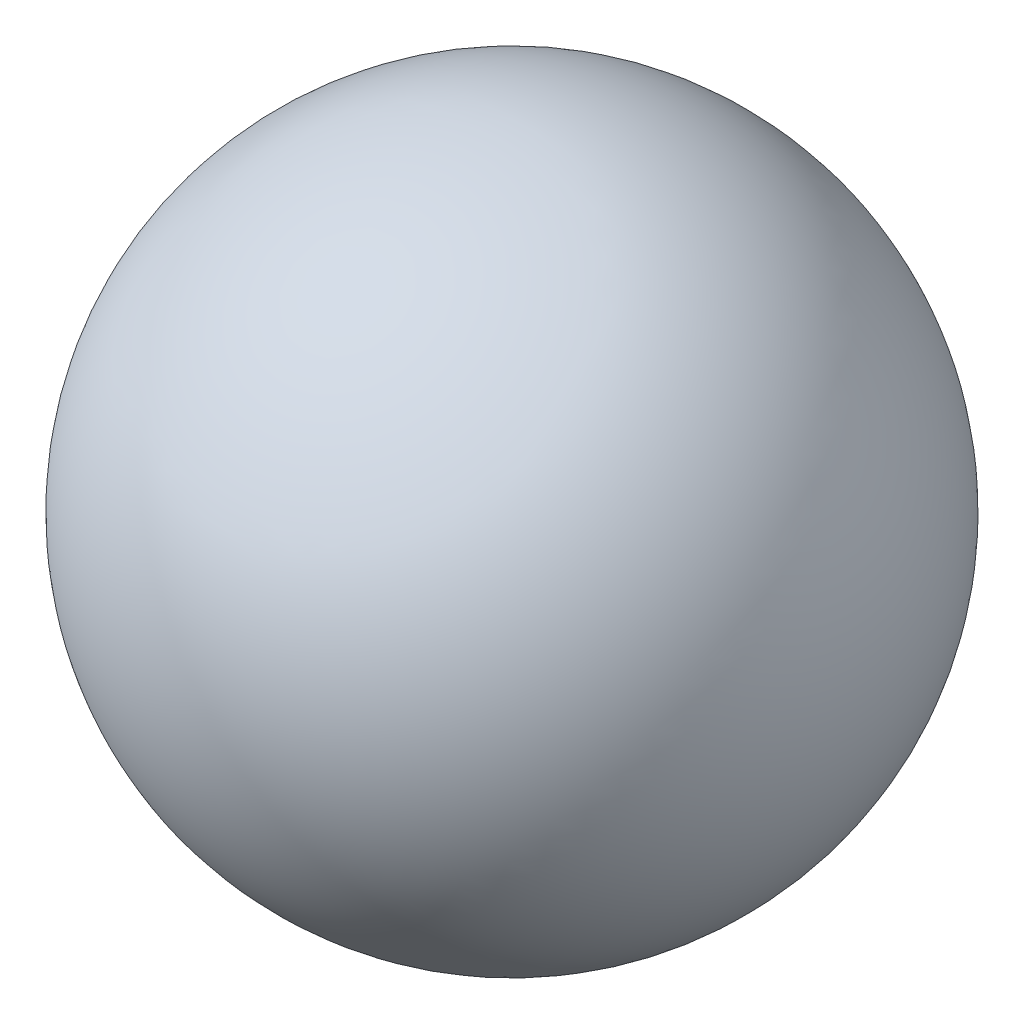
ISO-10303-21;
HEADER;
FILE_DESCRIPTION(('STEP AP214'),'2;1');
FILE_NAME('part.step','',(''),(''),'','','');
FILE_SCHEMA(('AUTOMOTIVE_DESIGN { 1 0 10303 214 1 1 1 1 }'));
ENDSEC;
DATA;
#1=APPLICATION_CONTEXT('core data for automotive mechanical design processes');
#2=APPLICATION_PROTOCOL_DEFINITION('international standard','automotive_design',2000,#1);
#3=PRODUCT_CONTEXT('',#1,'mechanical');
#4=PRODUCT('Part','Part','',(#3));
#5=PRODUCT_RELATED_PRODUCT_CATEGORY('part','',(#4));
#6=PRODUCT_DEFINITION_FORMATION('','',#4);
#7=PRODUCT_DEFINITION_CONTEXT('part definition',#1,'design');
#8=PRODUCT_DEFINITION('design','',#6,#7);
#9=PRODUCT_DEFINITION_SHAPE('','',#8);
#10=(LENGTH_UNIT() NAMED_UNIT(*) SI_UNIT(.MILLI.,.METRE.));
#11=(NAMED_UNIT(*) PLANE_ANGLE_UNIT() SI_UNIT($,.RADIAN.));
#12=(NAMED_UNIT(*) SI_UNIT($,.STERADIAN.) SOLID_ANGLE_UNIT());
#13=UNCERTAINTY_MEASURE_WITH_UNIT(LENGTH_MEASURE(1.E-05),#10,'distance_accuracy_value','');
#14=(GEOMETRIC_REPRESENTATION_CONTEXT(3) GLOBAL_UNCERTAINTY_ASSIGNED_CONTEXT((#13)) GLOBAL_UNIT_ASSIGNED_CONTEXT((#10,
#11,#12)) REPRESENTATION_CONTEXT('',''));
#15=CARTESIAN_POINT('',(0.,0.,0.));
#16=DIRECTION('',(0.,0.,1.));
#17=DIRECTION('',(1.,0.,0.));
#18=AXIS2_PLACEMENT_3D('',#15,#16,#17);
#19=CARTESIAN_POINT('',(0.,0.,0.));
#20=DIRECTION('',(0.,0.,-1.));
#21=DIRECTION('',(1.,0.,0.));
#22=AXIS2_PLACEMENT_3D('',#19,#20,#21);
#23=SPHERICAL_SURFACE('',#22,19.939);
#24=CARTESIAN_POINT('',(0.,0.,-19.939));
#25=VERTEX_POINT('',#24);
#26=VERTEX_LOOP('',#25);
#27=FACE_BOUND('',#26,.T.);
#28=ADVANCED_FACE('F31',(#27),#23,.T.);
#29=CLOSED_SHELL('',(#28));
#30=MANIFOLD_SOLID_BREP('B2',#29);
#31=ADVANCED_BREP_SHAPE_REPRESENTATION('',(#18,#30),#14);
#32=SHAPE_DEFINITION_REPRESENTATION(#9,#31);
ENDSEC;
END-ISO-10303-21;
